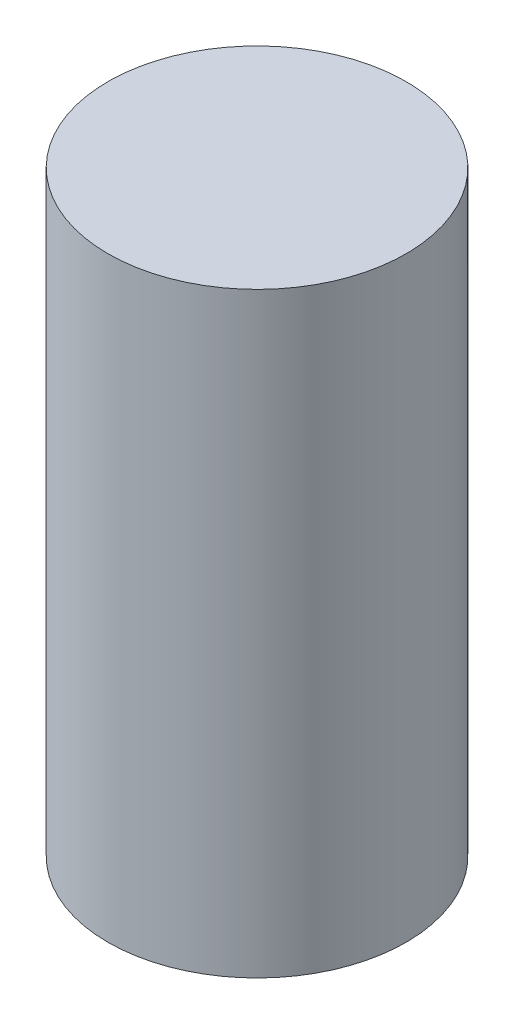
ISO-10303-21;
HEADER;
FILE_DESCRIPTION(('STEP AP214'),'2;1');
FILE_NAME('part.step','',(''),(''),'','','');
FILE_SCHEMA(('AUTOMOTIVE_DESIGN { 1 0 10303 214 1 1 1 1 }'));
ENDSEC;
DATA;
#1=APPLICATION_CONTEXT('core data for automotive mechanical design processes');
#2=APPLICATION_PROTOCOL_DEFINITION('international standard','automotive_design',2000,#1);
#3=PRODUCT_CONTEXT('',#1,'mechanical');
#4=PRODUCT('Part','Part','',(#3));
#5=PRODUCT_RELATED_PRODUCT_CATEGORY('part','',(#4));
#6=PRODUCT_DEFINITION_FORMATION('','',#4);
#7=PRODUCT_DEFINITION_CONTEXT('part definition',#1,'design');
#8=PRODUCT_DEFINITION('design','',#6,#7);
#9=PRODUCT_DEFINITION_SHAPE('','',#8);
#10=(LENGTH_UNIT() NAMED_UNIT(*) SI_UNIT(.MILLI.,.METRE.));
#11=(NAMED_UNIT(*) PLANE_ANGLE_UNIT() SI_UNIT($,.RADIAN.));
#12=(NAMED_UNIT(*) SI_UNIT($,.STERADIAN.) SOLID_ANGLE_UNIT());
#13=UNCERTAINTY_MEASURE_WITH_UNIT(LENGTH_MEASURE(1.E-05),#10,'distance_accuracy_value','');
#14=(GEOMETRIC_REPRESENTATION_CONTEXT(3) GLOBAL_UNCERTAINTY_ASSIGNED_CONTEXT((#13)) GLOBAL_UNIT_ASSIGNED_CONTEXT((#10,
#11,#12)) REPRESENTATION_CONTEXT('',''));
#15=CARTESIAN_POINT('',(0.,0.,0.));
#16=DIRECTION('',(0.,0.,1.));
#17=DIRECTION('',(1.,0.,0.));
#18=AXIS2_PLACEMENT_3D('',#15,#16,#17);
#19=CARTESIAN_POINT('',(0.,8.89,0.));
#20=DIRECTION('',(0.,-1.,0.));
#21=DIRECTION('',(0.,0.,-1.));
#22=AXIS2_PLACEMENT_3D('',#19,#20,#21);
#23=CYLINDRICAL_SURFACE('',#22,2.2225);
#24=CARTESIAN_POINT('',(0.,8.89,0.));
#25=DIRECTION('',(0.,1.,0.));
#26=DIRECTION('',(0.,0.,1.));
#27=AXIS2_PLACEMENT_3D('',#24,#25,#26);
#28=CIRCLE('',#27,2.2225);
#29=CARTESIAN_POINT('',(0.,8.89,2.2225));
#30=VERTEX_POINT('',#29);
#31=EDGE_CURVE('E10',#30,#30,#28,.T.);
#32=ORIENTED_EDGE('',*,*,#31,.F.);
#33=EDGE_LOOP('',(#32));
#34=FACE_BOUND('',#33,.T.);
#35=CARTESIAN_POINT('',(0.,0.,0.));
#36=DIRECTION('',(0.,1.,0.));
#37=DIRECTION('',(0.,0.,1.));
#38=AXIS2_PLACEMENT_3D('',#35,#36,#37);
#39=CIRCLE('',#38,2.2225);
#40=CARTESIAN_POINT('',(0.,0.,2.2225));
#41=VERTEX_POINT('',#40);
#42=EDGE_CURVE('E33',#41,#41,#39,.T.);
#43=ORIENTED_EDGE('',*,*,#42,.T.);
#44=EDGE_LOOP('',(#43));
#45=FACE_BOUND('',#44,.T.);
#46=ADVANCED_FACE('F30',(#34,#45),#23,.T.);
#47=CARTESIAN_POINT('',(0.,8.89,0.));
#48=DIRECTION('',(0.,1.,0.));
#49=DIRECTION('',(0.,0.,1.));
#50=AXIS2_PLACEMENT_3D('',#47,#48,#49);
#51=PLANE('',#50);
#52=ORIENTED_EDGE('',*,*,#31,.T.);
#53=EDGE_LOOP('',(#52));
#54=FACE_BOUND('',#53,.T.);
#55=ADVANCED_FACE('F45',(#54),#51,.T.);
#56=CARTESIAN_POINT('',(0.,0.,0.));
#57=DIRECTION('',(0.,1.,0.));
#58=DIRECTION('',(0.,0.,1.));
#59=AXIS2_PLACEMENT_3D('',#56,#57,#58);
#60=PLANE('',#59);
#61=ORIENTED_EDGE('',*,*,#42,.F.);
#62=EDGE_LOOP('',(#61));
#63=FACE_BOUND('',#62,.T.);
#64=ADVANCED_FACE('F43',(#63),#60,.F.);
#65=CLOSED_SHELL('',(#46,#55,#64));
#66=MANIFOLD_SOLID_BREP('B2',#65);
#67=ADVANCED_BREP_SHAPE_REPRESENTATION('',(#18,#66),#14);
#68=SHAPE_DEFINITION_REPRESENTATION(#9,#67);
ENDSEC;
END-ISO-10303-21;
